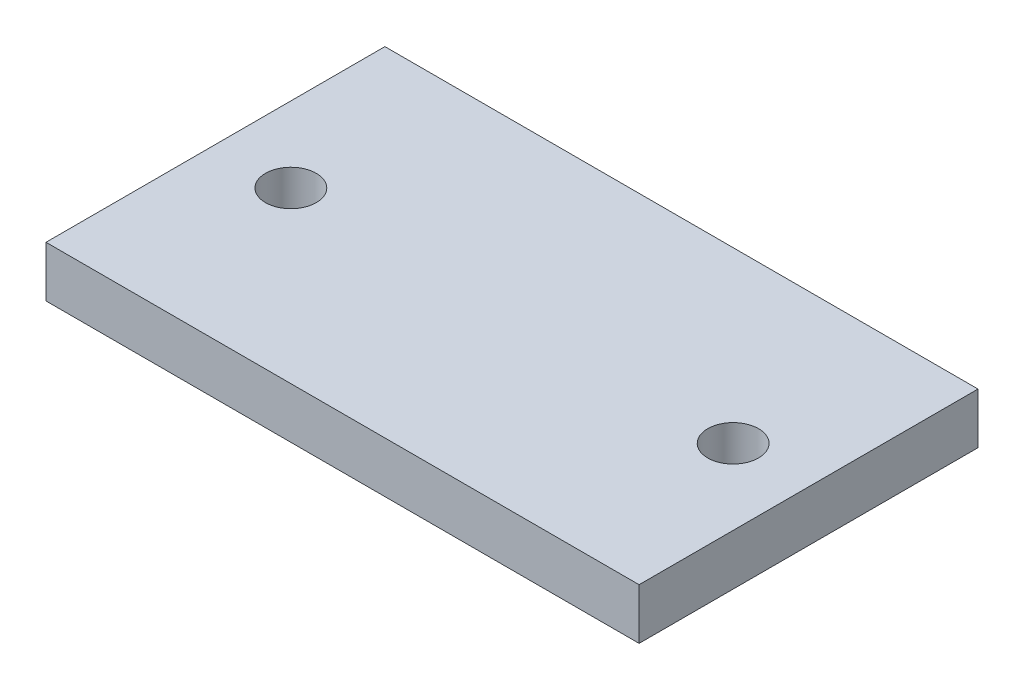
ISO-10303-21;
HEADER;
FILE_DESCRIPTION(('STEP AP214'),'2;1');
FILE_NAME('part.step','',(''),(''),'','','');
FILE_SCHEMA(('AUTOMOTIVE_DESIGN { 1 0 10303 214 1 1 1 1 }'));
ENDSEC;
DATA;
#1=APPLICATION_CONTEXT('core data for automotive mechanical design processes');
#2=APPLICATION_PROTOCOL_DEFINITION('international standard','automotive_design',2000,#1);
#3=PRODUCT_CONTEXT('',#1,'mechanical');
#4=PRODUCT('Part','Part','',(#3));
#5=PRODUCT_RELATED_PRODUCT_CATEGORY('part','',(#4));
#6=PRODUCT_DEFINITION_FORMATION('','',#4);
#7=PRODUCT_DEFINITION_CONTEXT('part definition',#1,'design');
#8=PRODUCT_DEFINITION('design','',#6,#7);
#9=PRODUCT_DEFINITION_SHAPE('','',#8);
#10=(LENGTH_UNIT() NAMED_UNIT(*) SI_UNIT(.MILLI.,.METRE.));
#11=(NAMED_UNIT(*) PLANE_ANGLE_UNIT() SI_UNIT($,.RADIAN.));
#12=(NAMED_UNIT(*) SI_UNIT($,.STERADIAN.) SOLID_ANGLE_UNIT());
#13=UNCERTAINTY_MEASURE_WITH_UNIT(LENGTH_MEASURE(1.E-05),#10,'distance_accuracy_value','');
#14=(GEOMETRIC_REPRESENTATION_CONTEXT(3) GLOBAL_UNCERTAINTY_ASSIGNED_CONTEXT((#13)) GLOBAL_UNIT_ASSIGNED_CONTEXT((#10,
#11,#12)) REPRESENTATION_CONTEXT('',''));
#15=CARTESIAN_POINT('',(0.,0.,0.));
#16=DIRECTION('',(0.,0.,1.));
#17=DIRECTION('',(1.,0.,0.));
#18=AXIS2_PLACEMENT_3D('',#15,#16,#17);
#19=CARTESIAN_POINT('',(0.,3.,0.));
#20=DIRECTION('',(0.,1.,0.));
#21=DIRECTION('',(0.,0.,1.));
#22=AXIS2_PLACEMENT_3D('',#19,#20,#21);
#23=PLANE('',#22);
#24=CARTESIAN_POINT('',(-13.05,3.,0.));
#25=DIRECTION('',(0.,1.,0.));
#26=DIRECTION('',(0.,0.,1.));
#27=AXIS2_PLACEMENT_3D('',#24,#25,#26);
#28=CIRCLE('',#27,1.5);
#29=CARTESIAN_POINT('',(-13.05,3.,1.5));
#30=VERTEX_POINT('',#29);
#31=EDGE_CURVE('E99',#30,#30,#28,.T.);
#32=ORIENTED_EDGE('',*,*,#31,.F.);
#33=EDGE_LOOP('',(#32));
#34=FACE_BOUND('',#33,.T.);
#35=DIRECTION('',(0.,0.,1.));
#36=VECTOR('',#35,1.);
#37=CARTESIAN_POINT('',(-17.5,3.,10.));
#38=LINE('',#37,#36);
#39=CARTESIAN_POINT('',(-17.5,3.,-10.));
#40=VERTEX_POINT('',#39);
#41=CARTESIAN_POINT('',(-17.5,3.,10.));
#42=VERTEX_POINT('',#41);
#43=EDGE_CURVE('E84',#40,#42,#38,.T.);
#44=ORIENTED_EDGE('',*,*,#43,.T.);
#45=DIRECTION('',(1.,0.,0.));
#46=VECTOR('',#45,1.);
#47=CARTESIAN_POINT('',(17.5,3.,9.99999999999999));
#48=LINE('',#47,#46);
#49=CARTESIAN_POINT('',(17.5,3.,9.99999999999999));
#50=VERTEX_POINT('',#49);
#51=EDGE_CURVE('E79',#42,#50,#48,.T.);
#52=ORIENTED_EDGE('',*,*,#51,.T.);
#53=DIRECTION('',(0.,0.,-1.));
#54=VECTOR('',#53,1.);
#55=CARTESIAN_POINT('',(17.5,3.,9.99999999999999));
#56=LINE('',#55,#54);
#57=CARTESIAN_POINT('',(17.5,3.,-10.));
#58=VERTEX_POINT('',#57);
#59=EDGE_CURVE('E82',#50,#58,#56,.T.);
#60=ORIENTED_EDGE('',*,*,#59,.T.);
#61=DIRECTION('',(-1.,0.,0.));
#62=VECTOR('',#61,1.);
#63=CARTESIAN_POINT('',(17.5,3.,-10.));
#64=LINE('',#63,#62);
#65=EDGE_CURVE('E49',#58,#40,#64,.T.);
#66=ORIENTED_EDGE('',*,*,#65,.T.);
#67=EDGE_LOOP('',(#44,#52,#60,#66));
#68=FACE_BOUND('',#67,.T.);
#69=CARTESIAN_POINT('',(13.05,3.,0.));
#70=DIRECTION('',(0.,1.,0.));
#71=DIRECTION('',(0.,0.,1.));
#72=AXIS2_PLACEMENT_3D('',#69,#70,#71);
#73=CIRCLE('',#72,1.5);
#74=CARTESIAN_POINT('',(13.05,3.,1.49999999999999));
#75=VERTEX_POINT('',#74);
#76=EDGE_CURVE('E114',#75,#75,#73,.T.);
#77=ORIENTED_EDGE('',*,*,#76,.F.);
#78=EDGE_LOOP('',(#77));
#79=FACE_BOUND('',#78,.T.);
#80=ADVANCED_FACE('F32',(#34,#68,#79),#23,.T.);
#81=CARTESIAN_POINT('',(0.,0.,0.));
#82=DIRECTION('',(0.,1.,0.));
#83=DIRECTION('',(0.,0.,1.));
#84=AXIS2_PLACEMENT_3D('',#81,#82,#83);
#85=PLANE('',#84);
#86=DIRECTION('',(0.,0.,1.));
#87=VECTOR('',#86,1.);
#88=CARTESIAN_POINT('',(-17.5,0.,10.));
#89=LINE('',#88,#87);
#90=CARTESIAN_POINT('',(-17.5,0.,-10.));
#91=VERTEX_POINT('',#90);
#92=CARTESIAN_POINT('',(-17.5,0.,10.));
#93=VERTEX_POINT('',#92);
#94=EDGE_CURVE('E96',#91,#93,#89,.T.);
#95=ORIENTED_EDGE('',*,*,#94,.F.);
#96=DIRECTION('',(-1.,0.,0.));
#97=VECTOR('',#96,1.);
#98=CARTESIAN_POINT('',(17.5,0.,-10.));
#99=LINE('',#98,#97);
#100=CARTESIAN_POINT('',(17.5,0.,-10.));
#101=VERTEX_POINT('',#100);
#102=EDGE_CURVE('E72',#101,#91,#99,.T.);
#103=ORIENTED_EDGE('',*,*,#102,.F.);
#104=DIRECTION('',(0.,0.,-1.));
#105=VECTOR('',#104,1.);
#106=CARTESIAN_POINT('',(17.5,0.,9.99999999999999));
#107=LINE('',#106,#105);
#108=CARTESIAN_POINT('',(17.5,0.,9.99999999999999));
#109=VERTEX_POINT('',#108);
#110=EDGE_CURVE('E66',#109,#101,#107,.T.);
#111=ORIENTED_EDGE('',*,*,#110,.F.);
#112=DIRECTION('',(1.,0.,0.));
#113=VECTOR('',#112,1.);
#114=CARTESIAN_POINT('',(17.5,0.,9.99999999999999));
#115=LINE('',#114,#113);
#116=EDGE_CURVE('E88',#93,#109,#115,.T.);
#117=ORIENTED_EDGE('',*,*,#116,.F.);
#118=EDGE_LOOP('',(#95,#103,#111,#117));
#119=FACE_BOUND('',#118,.T.);
#120=CARTESIAN_POINT('',(-13.05,0.,0.));
#121=DIRECTION('',(0.,1.,0.));
#122=DIRECTION('',(0.,0.,1.));
#123=AXIS2_PLACEMENT_3D('',#120,#121,#122);
#124=CIRCLE('',#123,1.5);
#125=CARTESIAN_POINT('',(-13.05,0.,1.5));
#126=VERTEX_POINT('',#125);
#127=EDGE_CURVE('E111',#126,#126,#124,.T.);
#128=ORIENTED_EDGE('',*,*,#127,.T.);
#129=EDGE_LOOP('',(#128));
#130=FACE_BOUND('',#129,.T.);
#131=CARTESIAN_POINT('',(13.05,0.,0.));
#132=DIRECTION('',(0.,1.,0.));
#133=DIRECTION('',(0.,0.,1.));
#134=AXIS2_PLACEMENT_3D('',#131,#132,#133);
#135=CIRCLE('',#134,1.5);
#136=CARTESIAN_POINT('',(13.05,0.,1.49999999999999));
#137=VERTEX_POINT('',#136);
#138=EDGE_CURVE('E117',#137,#137,#135,.T.);
#139=ORIENTED_EDGE('',*,*,#138,.T.);
#140=EDGE_LOOP('',(#139));
#141=FACE_BOUND('',#140,.T.);
#142=ADVANCED_FACE('F107',(#119,#130,#141),#85,.F.);
#143=CARTESIAN_POINT('',(-17.5,3.,10.));
#144=DIRECTION('',(1.,0.,0.));
#145=DIRECTION('',(0.,0.,-1.));
#146=AXIS2_PLACEMENT_3D('',#143,#144,#145);
#147=PLANE('',#146);
#148=ORIENTED_EDGE('',*,*,#94,.T.);
#149=DIRECTION('',(0.,-1.,0.));
#150=VECTOR('',#149,1.);
#151=CARTESIAN_POINT('',(-17.5,3.,10.));
#152=LINE('',#151,#150);
#153=EDGE_CURVE('E11',#42,#93,#152,.T.);
#154=ORIENTED_EDGE('',*,*,#153,.F.);
#155=ORIENTED_EDGE('',*,*,#43,.F.);
#156=DIRECTION('',(0.,-1.,0.));
#157=VECTOR('',#156,1.);
#158=CARTESIAN_POINT('',(-17.5,3.,-10.));
#159=LINE('',#158,#157);
#160=EDGE_CURVE('E92',#40,#91,#159,.T.);
#161=ORIENTED_EDGE('',*,*,#160,.T.);
#162=EDGE_LOOP('',(#148,#154,#155,#161));
#163=FACE_BOUND('',#162,.T.);
#164=ADVANCED_FACE('F34',(#163),#147,.F.);
#165=CARTESIAN_POINT('',(17.5,3.,9.99999999999999));
#166=DIRECTION('',(0.,0.,-1.));
#167=DIRECTION('',(-1.,0.,0.));
#168=AXIS2_PLACEMENT_3D('',#165,#166,#167);
#169=PLANE('',#168);
#170=ORIENTED_EDGE('',*,*,#116,.T.);
#171=DIRECTION('',(0.,-1.,0.));
#172=VECTOR('',#171,1.);
#173=CARTESIAN_POINT('',(17.5,3.,9.99999999999999));
#174=LINE('',#173,#172);
#175=EDGE_CURVE('E41',#50,#109,#174,.T.);
#176=ORIENTED_EDGE('',*,*,#175,.F.);
#177=ORIENTED_EDGE('',*,*,#51,.F.);
#178=ORIENTED_EDGE('',*,*,#153,.T.);
#179=EDGE_LOOP('',(#170,#176,#177,#178));
#180=FACE_BOUND('',#179,.T.);
#181=ADVANCED_FACE('F87',(#180),#169,.F.);
#182=CARTESIAN_POINT('',(17.5,3.,9.99999999999999));
#183=DIRECTION('',(-1.,0.,0.));
#184=DIRECTION('',(0.,0.,1.));
#185=AXIS2_PLACEMENT_3D('',#182,#183,#184);
#186=PLANE('',#185);
#187=ORIENTED_EDGE('',*,*,#110,.T.);
#188=DIRECTION('',(0.,-1.,0.));
#189=VECTOR('',#188,1.);
#190=CARTESIAN_POINT('',(17.5,3.,-10.));
#191=LINE('',#190,#189);
#192=EDGE_CURVE('E89',#58,#101,#191,.T.);
#193=ORIENTED_EDGE('',*,*,#192,.F.);
#194=ORIENTED_EDGE('',*,*,#59,.F.);
#195=ORIENTED_EDGE('',*,*,#175,.T.);
#196=EDGE_LOOP('',(#187,#193,#194,#195));
#197=FACE_BOUND('',#196,.T.);
#198=ADVANCED_FACE('F90',(#197),#186,.F.);
#199=CARTESIAN_POINT('',(17.5,3.,-10.));
#200=DIRECTION('',(0.,0.,1.));
#201=DIRECTION('',(1.,0.,0.));
#202=AXIS2_PLACEMENT_3D('',#199,#200,#201);
#203=PLANE('',#202);
#204=ORIENTED_EDGE('',*,*,#102,.T.);
#205=ORIENTED_EDGE('',*,*,#160,.F.);
#206=ORIENTED_EDGE('',*,*,#65,.F.);
#207=ORIENTED_EDGE('',*,*,#192,.T.);
#208=EDGE_LOOP('',(#204,#205,#206,#207));
#209=FACE_BOUND('',#208,.T.);
#210=ADVANCED_FACE('F104',(#209),#203,.F.);
#211=CARTESIAN_POINT('',(-13.05,3.,0.));
#212=DIRECTION('',(0.,-1.,0.));
#213=DIRECTION('',(0.,0.,-1.));
#214=AXIS2_PLACEMENT_3D('',#211,#212,#213);
#215=CYLINDRICAL_SURFACE('',#214,1.5);
#216=ORIENTED_EDGE('',*,*,#31,.T.);
#217=EDGE_LOOP('',(#216));
#218=FACE_BOUND('',#217,.T.);
#219=ORIENTED_EDGE('',*,*,#127,.F.);
#220=EDGE_LOOP('',(#219));
#221=FACE_BOUND('',#220,.T.);
#222=ADVANCED_FACE('F134',(#218,#221),#215,.F.);
#223=CARTESIAN_POINT('',(13.05,3.,0.));
#224=DIRECTION('',(0.,-1.,0.));
#225=DIRECTION('',(0.,0.,-1.));
#226=AXIS2_PLACEMENT_3D('',#223,#224,#225);
#227=CYLINDRICAL_SURFACE('',#226,1.5);
#228=ORIENTED_EDGE('',*,*,#76,.T.);
#229=EDGE_LOOP('',(#228));
#230=FACE_BOUND('',#229,.T.);
#231=ORIENTED_EDGE('',*,*,#138,.F.);
#232=EDGE_LOOP('',(#231));
#233=FACE_BOUND('',#232,.T.);
#234=ADVANCED_FACE('F123',(#230,#233),#227,.F.);
#235=CLOSED_SHELL('',(#80,#142,#164,#181,#198,#210,#222,#234));
#236=MANIFOLD_SOLID_BREP('B2',#235);
#237=ADVANCED_BREP_SHAPE_REPRESENTATION('',(#18,#236),#14);
#238=SHAPE_DEFINITION_REPRESENTATION(#9,#237);
ENDSEC;
END-ISO-10303-21;
